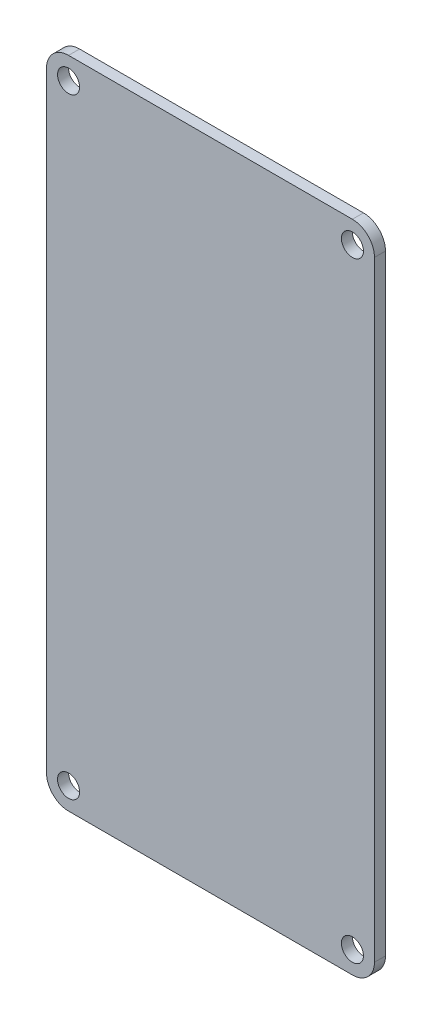
ISO-10303-21;
HEADER;
FILE_DESCRIPTION(('STEP AP214'),'2;1');
FILE_NAME('part.step','',(''),(''),'','','');
FILE_SCHEMA(('AUTOMOTIVE_DESIGN { 1 0 10303 214 1 1 1 1 }'));
ENDSEC;
DATA;
#1=APPLICATION_CONTEXT('core data for automotive mechanical design processes');
#2=APPLICATION_PROTOCOL_DEFINITION('international standard','automotive_design',2000,#1);
#3=PRODUCT_CONTEXT('',#1,'mechanical');
#4=PRODUCT('Part','Part','',(#3));
#5=PRODUCT_RELATED_PRODUCT_CATEGORY('part','',(#4));
#6=PRODUCT_DEFINITION_FORMATION('','',#4);
#7=PRODUCT_DEFINITION_CONTEXT('part definition',#1,'design');
#8=PRODUCT_DEFINITION('design','',#6,#7);
#9=PRODUCT_DEFINITION_SHAPE('','',#8);
#10=(LENGTH_UNIT() NAMED_UNIT(*) SI_UNIT(.MILLI.,.METRE.));
#11=(NAMED_UNIT(*) PLANE_ANGLE_UNIT() SI_UNIT($,.RADIAN.));
#12=(NAMED_UNIT(*) SI_UNIT($,.STERADIAN.) SOLID_ANGLE_UNIT());
#13=UNCERTAINTY_MEASURE_WITH_UNIT(LENGTH_MEASURE(1.E-05),#10,'distance_accuracy_value','');
#14=(GEOMETRIC_REPRESENTATION_CONTEXT(3) GLOBAL_UNCERTAINTY_ASSIGNED_CONTEXT((#13)) GLOBAL_UNIT_ASSIGNED_CONTEXT((#10,
#11,#12)) REPRESENTATION_CONTEXT('',''));
#15=CARTESIAN_POINT('',(0.,0.,0.));
#16=DIRECTION('',(0.,0.,1.));
#17=DIRECTION('',(1.,0.,0.));
#18=AXIS2_PLACEMENT_3D('',#15,#16,#17);
#19=CARTESIAN_POINT('',(53.3900587016313,32.2735485954356,178.99));
#20=DIRECTION('',(-3.9134233988859E-06,-0.999999999992343,0.));
#21=DIRECTION('',(0.999999999992343,-3.9134233988859E-06,0.));
#22=AXIS2_PLACEMENT_3D('',#19,#20,#21);
#23=PLANE('',#22);
#24=DIRECTION('',(0.,0.,1.));
#25=VECTOR('',#24,1.);
#26=CARTESIAN_POINT('',(53.4000587016312,32.2735485563014,179.8));
#27=LINE('',#26,#25);
#28=CARTESIAN_POINT('',(53.4000587016312,32.2735485563013,179.));
#29=VERTEX_POINT('',#28);
#30=CARTESIAN_POINT('',(53.4000587016312,32.2735485563013,180.6));
#31=VERTEX_POINT('',#30);
#32=EDGE_CURVE('E177',#29,#31,#27,.T.);
#33=ORIENTED_EDGE('',*,*,#32,.F.);
#34=DIRECTION('',(-0.999999999992343,3.91342339820936E-06,0.));
#35=VECTOR('',#34,1.);
#36=CARTESIAN_POINT('',(94.6000587013158,32.2733873232573,179.));
#37=LINE('',#36,#35);
#38=CARTESIAN_POINT('',(94.6000587013158,32.2733873232573,179.));
#39=VERTEX_POINT('',#38);
#40=EDGE_CURVE('E128',#39,#29,#37,.T.);
#41=ORIENTED_EDGE('',*,*,#40,.F.);
#42=DIRECTION('',(0.,0.,1.));
#43=VECTOR('',#42,1.);
#44=CARTESIAN_POINT('',(94.6000587013158,32.2733873232573,179.8));
#45=LINE('',#44,#43);
#46=CARTESIAN_POINT('',(94.6000587013158,32.2733873232573,180.6));
#47=VERTEX_POINT('',#46);
#48=EDGE_CURVE('E182',#39,#47,#45,.T.);
#49=ORIENTED_EDGE('',*,*,#48,.T.);
#50=DIRECTION('',(0.999999999992343,-3.91342339820936E-06,0.));
#51=VECTOR('',#50,1.);
#52=CARTESIAN_POINT('',(53.4000587016312,32.2735485563013,180.6));
#53=LINE('',#52,#51);
#54=EDGE_CURVE('E95',#31,#47,#53,.T.);
#55=ORIENTED_EDGE('',*,*,#54,.F.);
#56=EDGE_LOOP('',(#33,#41,#49,#55));
#57=FACE_BOUND('',#56,.T.);
#58=ADVANCED_FACE('F17',(#57),#23,.T.);
#59=CARTESIAN_POINT('',(53.400071224586,35.4735485562769,180.6));
#60=DIRECTION('',(0.,0.,-1.));
#61=DIRECTION('',(-1.,0.,0.));
#62=AXIS2_PLACEMENT_3D('',#59,#60,#61);
#63=CYLINDRICAL_SURFACE('',#62,3.19999999999995);
#64=CARTESIAN_POINT('',(53.400071224586,35.4735485562769,179.));
#65=DIRECTION('',(0.,0.,-1.));
#66=DIRECTION('',(-1.,0.,0.));
#67=AXIS2_PLACEMENT_3D('',#64,#65,#66);
#68=CIRCLE('',#67,3.19999999999995);
#69=CARTESIAN_POINT('',(50.2000712246106,35.4735610792317,179.));
#70=VERTEX_POINT('',#69);
#71=EDGE_CURVE('E125',#29,#70,#68,.T.);
#72=ORIENTED_EDGE('',*,*,#71,.F.);
#73=ORIENTED_EDGE('',*,*,#32,.T.);
#74=CARTESIAN_POINT('',(53.400071224586,35.4735485562769,180.6));
#75=DIRECTION('',(0.,0.,-1.));
#76=DIRECTION('',(-1.,0.,0.));
#77=AXIS2_PLACEMENT_3D('',#74,#75,#76);
#78=CIRCLE('',#77,3.19999999999995);
#79=CARTESIAN_POINT('',(50.2000712246106,35.4735610792317,180.6));
#80=VERTEX_POINT('',#79);
#81=EDGE_CURVE('E144',#80,#31,#78,.F.);
#82=ORIENTED_EDGE('',*,*,#81,.F.);
#83=DIRECTION('',(0.,0.,1.));
#84=VECTOR('',#83,1.);
#85=CARTESIAN_POINT('',(50.2000712246106,35.4735610792317,179.8));
#86=LINE('',#85,#84);
#87=EDGE_CURVE('E174',#70,#80,#86,.T.);
#88=ORIENTED_EDGE('',*,*,#87,.F.);
#89=EDGE_LOOP('',(#72,#73,#82,#88));
#90=FACE_BOUND('',#89,.T.);
#91=ADVANCED_FACE('F179',(#90),#63,.T.);
#92=CARTESIAN_POINT('',(50.200417993058,124.083561078553,178.99));
#93=DIRECTION('',(-0.999999999992343,3.91342339890529E-06,0.));
#94=DIRECTION('',(-3.91342339890529E-06,-0.999999999992343,0.));
#95=AXIS2_PLACEMENT_3D('',#92,#93,#94);
#96=PLANE('',#95);
#97=DIRECTION('',(0.,0.,1.));
#98=VECTOR('',#97,1.);
#99=CARTESIAN_POINT('',(50.2004179539237,124.073561078553,179.8));
#100=LINE('',#99,#98);
#101=CARTESIAN_POINT('',(50.2004179539237,124.073561078553,179.));
#102=VERTEX_POINT('',#101);
#103=CARTESIAN_POINT('',(50.2004179539237,124.073561078553,180.6));
#104=VERTEX_POINT('',#103);
#105=EDGE_CURVE('E166',#102,#104,#100,.T.);
#106=ORIENTED_EDGE('',*,*,#105,.F.);
#107=DIRECTION('',(3.91342339843407E-06,0.999999999992343,0.));
#108=VECTOR('',#107,1.);
#109=CARTESIAN_POINT('',(50.2000712246106,35.4735610792317,179.));
#110=LINE('',#109,#108);
#111=EDGE_CURVE('E122',#70,#102,#110,.T.);
#112=ORIENTED_EDGE('',*,*,#111,.F.);
#113=ORIENTED_EDGE('',*,*,#87,.T.);
#114=DIRECTION('',(-3.91342339851238E-06,-0.999999999992343,0.));
#115=VECTOR('',#114,1.);
#116=CARTESIAN_POINT('',(50.2004179539237,124.073561078553,180.6));
#117=LINE('',#116,#115);
#118=EDGE_CURVE('E146',#104,#80,#117,.T.);
#119=ORIENTED_EDGE('',*,*,#118,.F.);
#120=EDGE_LOOP('',(#106,#112,#113,#119));
#121=FACE_BOUND('',#120,.T.);
#122=ADVANCED_FACE('F172',(#121),#96,.T.);
#123=CARTESIAN_POINT('',(53.4004179538991,124.073548555598,180.6));
#124=DIRECTION('',(0.,0.,-1.));
#125=DIRECTION('',(-1.,0.,0.));
#126=AXIS2_PLACEMENT_3D('',#123,#124,#125);
#127=CYLINDRICAL_SURFACE('',#126,3.20000000000015);
#128=CARTESIAN_POINT('',(53.4004179538991,124.073548555598,179.));
#129=DIRECTION('',(0.,0.,-1.));
#130=DIRECTION('',(-1.,0.,0.));
#131=AXIS2_PLACEMENT_3D('',#128,#129,#130);
#132=CIRCLE('',#131,3.20000000000015);
#133=CARTESIAN_POINT('',(53.400430476854,127.273548555574,179.));
#134=VERTEX_POINT('',#133);
#135=EDGE_CURVE('E119',#102,#134,#132,.T.);
#136=ORIENTED_EDGE('',*,*,#135,.F.);
#137=ORIENTED_EDGE('',*,*,#105,.T.);
#138=CARTESIAN_POINT('',(53.4004179538991,124.073548555598,180.6));
#139=DIRECTION('',(0.,0.,-1.));
#140=DIRECTION('',(-1.,0.,0.));
#141=AXIS2_PLACEMENT_3D('',#138,#139,#140);
#142=CIRCLE('',#141,3.20000000000015);
#143=CARTESIAN_POINT('',(53.400430476854,127.273548555574,180.6));
#144=VERTEX_POINT('',#143);
#145=EDGE_CURVE('E149',#144,#104,#142,.F.);
#146=ORIENTED_EDGE('',*,*,#145,.F.);
#147=DIRECTION('',(0.,0.,1.));
#148=VECTOR('',#147,1.);
#149=CARTESIAN_POINT('',(53.4004304768541,127.273548555574,179.8));
#150=LINE('',#149,#148);
#151=EDGE_CURVE('E160',#134,#144,#150,.T.);
#152=ORIENTED_EDGE('',*,*,#151,.F.);
#153=EDGE_LOOP('',(#136,#137,#146,#152));
#154=FACE_BOUND('',#153,.T.);
#155=ADVANCED_FACE('F168',(#154),#127,.T.);
#156=CARTESIAN_POINT('',(94.6104304765386,127.273387283396,178.99));
#157=DIRECTION('',(3.91342338676557E-06,0.999999999992343,0.));
#158=DIRECTION('',(-0.999999999992343,3.91342338676557E-06,0.));
#159=AXIS2_PLACEMENT_3D('',#156,#157,#158);
#160=PLANE('',#159);
#161=DIRECTION('',(0.,0.,1.));
#162=VECTOR('',#161,1.);
#163=CARTESIAN_POINT('',(94.6004304765386,127.27338732253,179.8));
#164=LINE('',#163,#162);
#165=CARTESIAN_POINT('',(94.6004304765385,127.27338732253,179.));
#166=VERTEX_POINT('',#165);
#167=CARTESIAN_POINT('',(94.6004304765385,127.27338732253,180.6));
#168=VERTEX_POINT('',#167);
#169=EDGE_CURVE('E82',#166,#168,#164,.T.);
#170=ORIENTED_EDGE('',*,*,#169,.F.);
#171=DIRECTION('',(0.999999999992342,-3.91342339871463E-06,0.));
#172=VECTOR('',#171,1.);
#173=CARTESIAN_POINT('',(53.4004304768541,127.273548555574,179.));
#174=LINE('',#173,#172);
#175=EDGE_CURVE('E116',#134,#166,#174,.T.);
#176=ORIENTED_EDGE('',*,*,#175,.F.);
#177=ORIENTED_EDGE('',*,*,#151,.T.);
#178=DIRECTION('',(-0.999999999992343,3.91342339871463E-06,0.));
#179=VECTOR('',#178,1.);
#180=CARTESIAN_POINT('',(94.6004304765386,127.27338732253,180.6));
#181=LINE('',#180,#179);
#182=EDGE_CURVE('E152',#168,#144,#181,.T.);
#183=ORIENTED_EDGE('',*,*,#182,.F.);
#184=EDGE_LOOP('',(#170,#176,#177,#183));
#185=FACE_BOUND('',#184,.T.);
#186=ADVANCED_FACE('F162',(#185),#160,.T.);
#187=CARTESIAN_POINT('',(94.6004179535836,124.073387322554,180.6));
#188=DIRECTION('',(0.,0.,-1.));
#189=DIRECTION('',(-1.,0.,0.));
#190=AXIS2_PLACEMENT_3D('',#187,#188,#189);
#191=CYLINDRICAL_SURFACE('',#190,3.20000000000038);
#192=CARTESIAN_POINT('',(94.6004179535836,124.073387322554,179.));
#193=DIRECTION('',(0.,0.,-1.));
#194=DIRECTION('',(-1.,0.,0.));
#195=AXIS2_PLACEMENT_3D('',#192,#193,#194);
#196=CIRCLE('',#195,3.20000000000038);
#197=CARTESIAN_POINT('',(97.8004179535593,124.073374799599,179.));
#198=VERTEX_POINT('',#197);
#199=EDGE_CURVE('E113',#166,#198,#196,.T.);
#200=ORIENTED_EDGE('',*,*,#199,.F.);
#201=ORIENTED_EDGE('',*,*,#169,.T.);
#202=CARTESIAN_POINT('',(94.6004179535836,124.073387322554,180.6));
#203=DIRECTION('',(0.,0.,-1.));
#204=DIRECTION('',(-1.,0.,0.));
#205=AXIS2_PLACEMENT_3D('',#202,#203,#204);
#206=CIRCLE('',#205,3.20000000000038);
#207=CARTESIAN_POINT('',(97.8004179535593,124.073374799599,180.6));
#208=VERTEX_POINT('',#207);
#209=EDGE_CURVE('E90',#208,#168,#206,.F.);
#210=ORIENTED_EDGE('',*,*,#209,.F.);
#211=DIRECTION('',(0.,0.,1.));
#212=VECTOR('',#211,1.);
#213=CARTESIAN_POINT('',(97.8004179535592,124.073374799599,179.8));
#214=LINE('',#213,#212);
#215=EDGE_CURVE('E81',#198,#208,#214,.T.);
#216=ORIENTED_EDGE('',*,*,#215,.F.);
#217=EDGE_LOOP('',(#200,#201,#210,#216));
#218=FACE_BOUND('',#217,.T.);
#219=ADVANCED_FACE('F157',(#218),#191,.T.);
#220=CARTESIAN_POINT('',(97.8000711851119,35.463374800278,178.99));
#221=DIRECTION('',(0.999999999992343,-3.9134233987487E-06,0.));
#222=DIRECTION('',(3.9134233987487E-06,0.999999999992343,0.));
#223=AXIS2_PLACEMENT_3D('',#220,#221,#222);
#224=PLANE('',#223);
#225=ORIENTED_EDGE('',*,*,#215,.T.);
#226=DIRECTION('',(3.91342339898229E-06,0.999999999992343,0.));
#227=VECTOR('',#226,1.);
#228=CARTESIAN_POINT('',(97.8000712242461,35.4733748002779,180.6));
#229=LINE('',#228,#227);
#230=CARTESIAN_POINT('',(97.8000712242461,35.4733748002779,180.6));
#231=VERTEX_POINT('',#230);
#232=EDGE_CURVE('E21',#231,#208,#229,.T.);
#233=ORIENTED_EDGE('',*,*,#232,.F.);
#234=DIRECTION('',(0.,0.,-1.));
#235=VECTOR('',#234,1.);
#236=CARTESIAN_POINT('',(97.8000712242461,35.4733748002779,179.8));
#237=LINE('',#236,#235);
#238=CARTESIAN_POINT('',(97.8000712242461,35.4733748002779,179.));
#239=VERTEX_POINT('',#238);
#240=EDGE_CURVE('E36',#231,#239,#237,.T.);
#241=ORIENTED_EDGE('',*,*,#240,.T.);
#242=DIRECTION('',(-3.91342339913893E-06,-0.999999999992343,0.));
#243=VECTOR('',#242,1.);
#244=CARTESIAN_POINT('',(97.8004179535593,124.073374799599,179.));
#245=LINE('',#244,#243);
#246=EDGE_CURVE('E111',#198,#239,#245,.T.);
#247=ORIENTED_EDGE('',*,*,#246,.F.);
#248=EDGE_LOOP('',(#225,#233,#241,#247));
#249=FACE_BOUND('',#248,.T.);
#250=ADVANCED_FACE('F86',(#249),#224,.T.);
#251=CARTESIAN_POINT('',(94.6005658034768,124.07138732195,180.6));
#252=DIRECTION('',(0.,0.,-1.));
#253=DIRECTION('',(-1.,0.,0.));
#254=AXIS2_PLACEMENT_3D('',#251,#252,#253);
#255=CYLINDRICAL_SURFACE('',#254,1.6);
#256=CARTESIAN_POINT('',(94.6005658034768,124.07138732195,179.));
#257=DIRECTION('',(0.,0.,-1.));
#258=DIRECTION('',(-1.,0.,0.));
#259=AXIS2_PLACEMENT_3D('',#256,#257,#258);
#260=CIRCLE('',#259,1.6);
#261=CARTESIAN_POINT('',(93.0005658034768,124.07138732195,179.));
#262=VERTEX_POINT('',#261);
#263=EDGE_CURVE('E108',#262,#262,#260,.F.);
#264=ORIENTED_EDGE('',*,*,#263,.F.);
#265=EDGE_LOOP('',(#264));
#266=FACE_BOUND('',#265,.T.);
#267=CARTESIAN_POINT('',(94.6005658034768,124.07138732195,180.6));
#268=DIRECTION('',(0.,0.,-1.));
#269=DIRECTION('',(-1.,0.,0.));
#270=AXIS2_PLACEMENT_3D('',#267,#268,#269);
#271=CIRCLE('',#270,1.6);
#272=CARTESIAN_POINT('',(93.0005658034768,124.07138732195,180.6));
#273=VERTEX_POINT('',#272);
#274=EDGE_CURVE('E140',#273,#273,#271,.T.);
#275=ORIENTED_EDGE('',*,*,#274,.F.);
#276=EDGE_LOOP('',(#275));
#277=FACE_BOUND('',#276,.T.);
#278=ADVANCED_FACE('F210',(#266,#277),#255,.F.);
#279=CARTESIAN_POINT('',(94.6002190819905,35.4733873226542,180.6));
#280=DIRECTION('',(0.,0.,-1.));
#281=DIRECTION('',(-1.,0.,0.));
#282=AXIS2_PLACEMENT_3D('',#279,#280,#281);
#283=CYLINDRICAL_SURFACE('',#282,1.60000000000001);
#284=CARTESIAN_POINT('',(94.6002190819905,35.4733873226542,179.));
#285=DIRECTION('',(0.,0.,-1.));
#286=DIRECTION('',(-1.,0.,0.));
#287=AXIS2_PLACEMENT_3D('',#284,#285,#286);
#288=CIRCLE('',#287,1.60000000000001);
#289=CARTESIAN_POINT('',(93.0002190819905,35.4733873226542,179.));
#290=VERTEX_POINT('',#289);
#291=EDGE_CURVE('E105',#290,#290,#288,.F.);
#292=ORIENTED_EDGE('',*,*,#291,.F.);
#293=EDGE_LOOP('',(#292));
#294=FACE_BOUND('',#293,.T.);
#295=CARTESIAN_POINT('',(94.6002190819905,35.4733873226542,180.6));
#296=DIRECTION('',(0.,0.,-1.));
#297=DIRECTION('',(-1.,0.,0.));
#298=AXIS2_PLACEMENT_3D('',#295,#296,#297);
#299=CIRCLE('',#298,1.60000000000001);
#300=CARTESIAN_POINT('',(93.0002190819905,35.4733873226542,180.6));
#301=VERTEX_POINT('',#300);
#302=EDGE_CURVE('E137',#301,#301,#299,.T.);
#303=ORIENTED_EDGE('',*,*,#302,.F.);
#304=EDGE_LOOP('',(#303));
#305=FACE_BOUND('',#304,.T.);
#306=ADVANCED_FACE('F206',(#294,#305),#283,.F.);
#307=CARTESIAN_POINT('',(53.4005125209549,124.071548555178,180.6));
#308=DIRECTION('',(0.,0.,-1.));
#309=DIRECTION('',(-1.,0.,0.));
#310=AXIS2_PLACEMENT_3D('',#307,#308,#309);
#311=CYLINDRICAL_SURFACE('',#310,1.59999999999998);
#312=CARTESIAN_POINT('',(53.4005125209549,124.071548555178,179.));
#313=DIRECTION('',(0.,0.,-1.));
#314=DIRECTION('',(-1.,0.,0.));
#315=AXIS2_PLACEMENT_3D('',#312,#313,#314);
#316=CIRCLE('',#315,1.59999999999998);
#317=CARTESIAN_POINT('',(51.8005125209549,124.071548555178,179.));
#318=VERTEX_POINT('',#317);
#319=EDGE_CURVE('E99',#318,#318,#316,.F.);
#320=ORIENTED_EDGE('',*,*,#319,.F.);
#321=EDGE_LOOP('',(#320));
#322=FACE_BOUND('',#321,.T.);
#323=CARTESIAN_POINT('',(53.4005125209549,124.071548555178,180.6));
#324=DIRECTION('',(0.,0.,-1.));
#325=DIRECTION('',(-1.,0.,0.));
#326=AXIS2_PLACEMENT_3D('',#323,#324,#325);
#327=CIRCLE('',#326,1.59999999999998);
#328=CARTESIAN_POINT('',(51.8005125209549,124.071548555178,180.6));
#329=VERTEX_POINT('',#328);
#330=EDGE_CURVE('E134',#329,#329,#327,.T.);
#331=ORIENTED_EDGE('',*,*,#330,.F.);
#332=EDGE_LOOP('',(#331));
#333=FACE_BOUND('',#332,.T.);
#334=ADVANCED_FACE('F202',(#322,#333),#311,.F.);
#335=CARTESIAN_POINT('',(53.4001657994686,35.4735485559067,180.6));
#336=DIRECTION('',(0.,0.,-1.));
#337=DIRECTION('',(-1.,0.,0.));
#338=AXIS2_PLACEMENT_3D('',#335,#336,#337);
#339=CYLINDRICAL_SURFACE('',#338,1.6);
#340=CARTESIAN_POINT('',(53.4001657994686,35.4735485559067,179.));
#341=DIRECTION('',(0.,0.,-1.));
#342=DIRECTION('',(-1.,0.,0.));
#343=AXIS2_PLACEMENT_3D('',#340,#341,#342);
#344=CIRCLE('',#343,1.6);
#345=CARTESIAN_POINT('',(51.8001657994686,35.4735485559067,179.));
#346=VERTEX_POINT('',#345);
#347=EDGE_CURVE('E96',#346,#346,#344,.F.);
#348=ORIENTED_EDGE('',*,*,#347,.F.);
#349=EDGE_LOOP('',(#348));
#350=FACE_BOUND('',#349,.T.);
#351=CARTESIAN_POINT('',(53.4001657994686,35.4735485559067,180.6));
#352=DIRECTION('',(0.,0.,-1.));
#353=DIRECTION('',(-1.,0.,0.));
#354=AXIS2_PLACEMENT_3D('',#351,#352,#353);
#355=CIRCLE('',#354,1.6);
#356=CARTESIAN_POINT('',(51.8001657994686,35.4735485559067,180.6));
#357=VERTEX_POINT('',#356);
#358=EDGE_CURVE('E131',#357,#357,#355,.T.);
#359=ORIENTED_EDGE('',*,*,#358,.F.);
#360=EDGE_LOOP('',(#359));
#361=FACE_BOUND('',#360,.T.);
#362=ADVANCED_FACE('F195',(#350,#361),#339,.F.);
#363=CARTESIAN_POINT('',(50.1900587016558,32.2633748003025,180.6));
#364=DIRECTION('',(0.,0.,1.));
#365=DIRECTION('',(1.,0.,0.));
#366=AXIS2_PLACEMENT_3D('',#363,#364,#365);
#367=PLANE('',#366);
#368=ORIENTED_EDGE('',*,*,#358,.T.);
#369=EDGE_LOOP('',(#368));
#370=FACE_BOUND('',#369,.T.);
#371=ORIENTED_EDGE('',*,*,#330,.T.);
#372=EDGE_LOOP('',(#371));
#373=FACE_BOUND('',#372,.T.);
#374=ORIENTED_EDGE('',*,*,#302,.T.);
#375=EDGE_LOOP('',(#374));
#376=FACE_BOUND('',#375,.T.);
#377=ORIENTED_EDGE('',*,*,#274,.T.);
#378=EDGE_LOOP('',(#377));
#379=FACE_BOUND('',#378,.T.);
#380=ORIENTED_EDGE('',*,*,#81,.T.);
#381=ORIENTED_EDGE('',*,*,#54,.T.);
#382=CARTESIAN_POINT('',(94.6000712242707,35.4733873232328,180.6));
#383=DIRECTION('',(0.,0.,-1.));
#384=DIRECTION('',(-1.,0.,0.));
#385=AXIS2_PLACEMENT_3D('',#382,#383,#384);
#386=CIRCLE('',#385,3.19999999999996);
#387=EDGE_CURVE('E27',#231,#47,#386,.T.);
#388=ORIENTED_EDGE('',*,*,#387,.F.);
#389=ORIENTED_EDGE('',*,*,#232,.T.);
#390=ORIENTED_EDGE('',*,*,#209,.T.);
#391=ORIENTED_EDGE('',*,*,#182,.T.);
#392=ORIENTED_EDGE('',*,*,#145,.T.);
#393=ORIENTED_EDGE('',*,*,#118,.T.);
#394=EDGE_LOOP('',(#380,#381,#388,#389,#390,#391,#392,#393));
#395=FACE_BOUND('',#394,.T.);
#396=ADVANCED_FACE('F93',(#370,#373,#376,#379,#395),#367,.T.);
#397=CARTESIAN_POINT('',(97.8104304765141,32.2633748003025,179.));
#398=DIRECTION('',(0.,0.,-1.));
#399=DIRECTION('',(-1.,0.,0.));
#400=AXIS2_PLACEMENT_3D('',#397,#398,#399);
#401=PLANE('',#400);
#402=ORIENTED_EDGE('',*,*,#347,.T.);
#403=EDGE_LOOP('',(#402));
#404=FACE_BOUND('',#403,.T.);
#405=ORIENTED_EDGE('',*,*,#319,.T.);
#406=EDGE_LOOP('',(#405));
#407=FACE_BOUND('',#406,.T.);
#408=ORIENTED_EDGE('',*,*,#291,.T.);
#409=EDGE_LOOP('',(#408));
#410=FACE_BOUND('',#409,.T.);
#411=ORIENTED_EDGE('',*,*,#263,.T.);
#412=EDGE_LOOP('',(#411));
#413=FACE_BOUND('',#412,.T.);
#414=ORIENTED_EDGE('',*,*,#199,.T.);
#415=ORIENTED_EDGE('',*,*,#246,.T.);
#416=CARTESIAN_POINT('',(94.6000712242707,35.4733873232328,179.));
#417=DIRECTION('',(0.,0.,-1.));
#418=DIRECTION('',(-1.,0.,0.));
#419=AXIS2_PLACEMENT_3D('',#416,#417,#418);
#420=CIRCLE('',#419,3.19999999999996);
#421=EDGE_CURVE('E11',#39,#239,#420,.F.);
#422=ORIENTED_EDGE('',*,*,#421,.F.);
#423=ORIENTED_EDGE('',*,*,#40,.T.);
#424=ORIENTED_EDGE('',*,*,#71,.T.);
#425=ORIENTED_EDGE('',*,*,#111,.T.);
#426=ORIENTED_EDGE('',*,*,#135,.T.);
#427=ORIENTED_EDGE('',*,*,#175,.T.);
#428=EDGE_LOOP('',(#414,#415,#422,#423,#424,#425,#426,#427));
#429=FACE_BOUND('',#428,.T.);
#430=ADVANCED_FACE('F187',(#404,#407,#410,#413,#429),#401,.T.);
#431=CARTESIAN_POINT('',(94.6000712242707,35.4733873232328,180.6));
#432=DIRECTION('',(0.,0.,-1.));
#433=DIRECTION('',(-1.,0.,0.));
#434=AXIS2_PLACEMENT_3D('',#431,#432,#433);
#435=CYLINDRICAL_SURFACE('',#434,3.19999999999996);
#436=ORIENTED_EDGE('',*,*,#421,.T.);
#437=ORIENTED_EDGE('',*,*,#240,.F.);
#438=ORIENTED_EDGE('',*,*,#387,.T.);
#439=ORIENTED_EDGE('',*,*,#48,.F.);
#440=EDGE_LOOP('',(#436,#437,#438,#439));
#441=FACE_BOUND('',#440,.T.);
#442=ADVANCED_FACE('F19',(#441),#435,.T.);
#443=CLOSED_SHELL('',(#58,#91,#122,#155,#186,#219,#250,#278,#306,#334,#362,#396,#430,#442));
#444=MANIFOLD_SOLID_BREP('B1',#443);
#445=ADVANCED_BREP_SHAPE_REPRESENTATION('',(#18,#444),#14);
#446=SHAPE_DEFINITION_REPRESENTATION(#9,#445);
ENDSEC;
END-ISO-10303-21;
